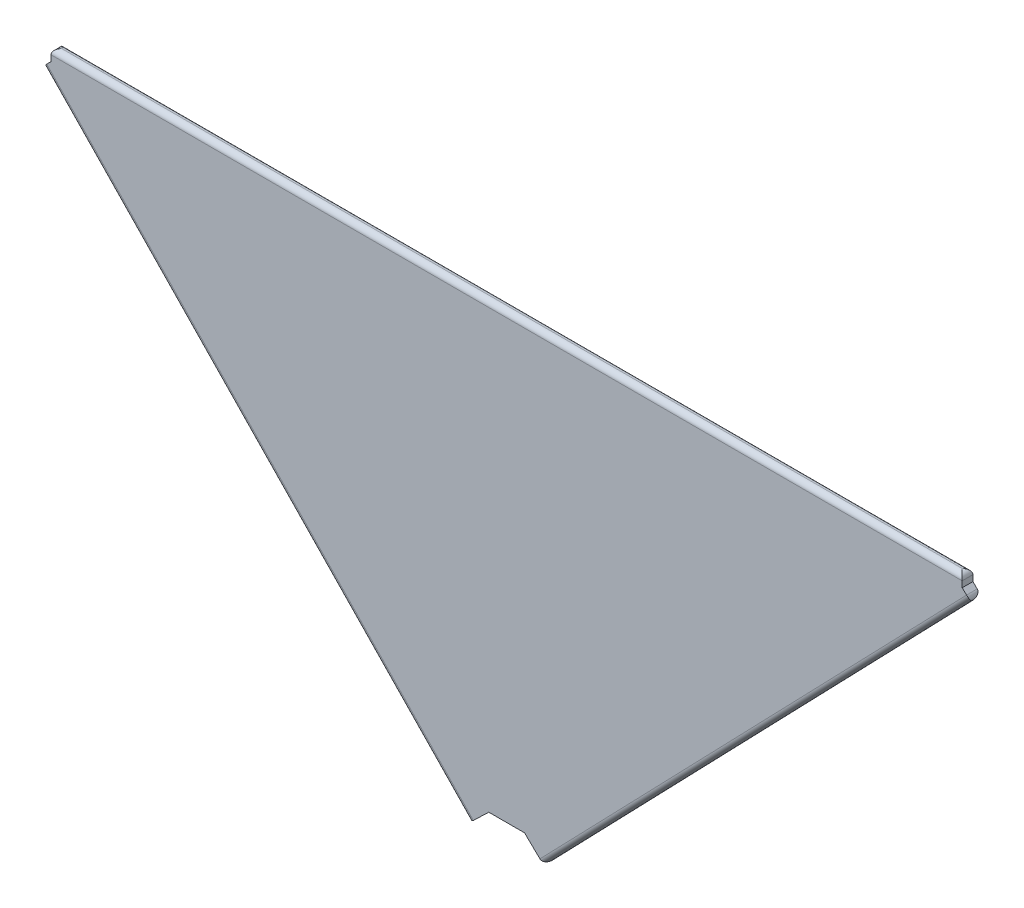
ISO-10303-21;
HEADER;
FILE_DESCRIPTION(('STEP AP214'),'2;1');
FILE_NAME('part.step','',(''),(''),'','','');
FILE_SCHEMA(('AUTOMOTIVE_DESIGN { 1 0 10303 214 1 1 1 1 }'));
ENDSEC;
DATA;
#1=APPLICATION_CONTEXT('core data for automotive mechanical design processes');
#2=APPLICATION_PROTOCOL_DEFINITION('international standard','automotive_design',2000,#1);
#3=PRODUCT_CONTEXT('',#1,'mechanical');
#4=PRODUCT('Part','Part','',(#3));
#5=PRODUCT_RELATED_PRODUCT_CATEGORY('part','',(#4));
#6=PRODUCT_DEFINITION_FORMATION('','',#4);
#7=PRODUCT_DEFINITION_CONTEXT('part definition',#1,'design');
#8=PRODUCT_DEFINITION('design','',#6,#7);
#9=PRODUCT_DEFINITION_SHAPE('','',#8);
#10=(LENGTH_UNIT() NAMED_UNIT(*) SI_UNIT(.MILLI.,.METRE.));
#11=(NAMED_UNIT(*) PLANE_ANGLE_UNIT() SI_UNIT($,.RADIAN.));
#12=(NAMED_UNIT(*) SI_UNIT($,.STERADIAN.) SOLID_ANGLE_UNIT());
#13=UNCERTAINTY_MEASURE_WITH_UNIT(LENGTH_MEASURE(1.E-05),#10,'distance_accuracy_value','');
#14=(GEOMETRIC_REPRESENTATION_CONTEXT(3) GLOBAL_UNCERTAINTY_ASSIGNED_CONTEXT((#13)) GLOBAL_UNIT_ASSIGNED_CONTEXT((#10,
#11,#12)) REPRESENTATION_CONTEXT('',''));
#15=CARTESIAN_POINT('',(0.,0.,0.));
#16=DIRECTION('',(0.,0.,1.));
#17=DIRECTION('',(1.,0.,0.));
#18=AXIS2_PLACEMENT_3D('',#15,#16,#17);
#19=CARTESIAN_POINT('',(8.335900445508,-8.63207760406378,0.2));
#20=DIRECTION('',(-0.694658370459,0.719339800338648,0.));
#21=DIRECTION('',(-0.719339800338648,-0.694658370459,0.));
#22=AXIS2_PLACEMENT_3D('',#19,#20,#21);
#23=PLANE('',#22);
#24=DIRECTION('',(0.719339800338648,0.694658370459,0.));
#25=VECTOR('',#24,1.);
#26=CARTESIAN_POINT('',(8.335900445508,-8.63207760406378,0.2));
#27=LINE('',#26,#25);
#28=CARTESIAN_POINT('',(8.40783442554188,-8.56261176701786,0.2));
#29=VERTEX_POINT('',#28);
#30=CARTESIAN_POINT('',(8.69557034567735,-8.28474841883426,0.2));
#31=VERTEX_POINT('',#30);
#32=EDGE_CURVE('E177',#29,#31,#27,.T.);
#33=ORIENTED_EDGE('',*,*,#32,.F.);
#34=DIRECTION('',(0.,0.,-1.));
#35=VECTOR('',#34,1.);
#36=CARTESIAN_POINT('',(8.40783442554188,-8.56261176701786,0.));
#37=LINE('',#36,#35);
#38=CARTESIAN_POINT('',(8.40783442554188,-8.56261176701786,0.));
#39=VERTEX_POINT('',#38);
#40=EDGE_CURVE('E133',#29,#39,#37,.T.);
#41=ORIENTED_EDGE('',*,*,#40,.T.);
#42=DIRECTION('',(0.719339800338648,0.694658370459,0.));
#43=VECTOR('',#42,1.);
#44=CARTESIAN_POINT('',(8.335900445508,-8.63207760406378,0.));
#45=LINE('',#44,#43);
#46=CARTESIAN_POINT('',(8.69557034567735,-8.28474841883426,0.));
#47=VERTEX_POINT('',#46);
#48=EDGE_CURVE('E120',#39,#47,#45,.T.);
#49=ORIENTED_EDGE('',*,*,#48,.T.);
#50=DIRECTION('',(0.,0.,-1.));
#51=VECTOR('',#50,1.);
#52=CARTESIAN_POINT('',(8.69557034567735,-8.28474841883426,0.2));
#53=LINE('',#52,#51);
#54=EDGE_CURVE('E161',#31,#47,#53,.T.);
#55=ORIENTED_EDGE('',*,*,#54,.F.);
#56=EDGE_LOOP('',(#33,#41,#49,#55));
#57=FACE_BOUND('',#56,.T.);
#58=ADVANCED_FACE('F38',(#57),#23,.F.);
#59=CARTESIAN_POINT('',(-1.28706646789534E-13,-8.28474841883413,0.2));
#60=DIRECTION('',(0.,1.,0.));
#61=DIRECTION('',(-1.,0.,0.));
#62=AXIS2_PLACEMENT_3D('',#59,#60,#61);
#63=PLANE('',#62);
#64=DIRECTION('',(1.,0.,0.));
#65=VECTOR('',#64,1.);
#66=CARTESIAN_POINT('',(-1.28706646789534E-13,-8.28474841883413,0.));
#67=LINE('',#66,#65);
#68=CARTESIAN_POINT('',(9.3655472862567,-8.28474841883427,0.));
#69=VERTEX_POINT('',#68);
#70=EDGE_CURVE('E188',#47,#69,#67,.T.);
#71=ORIENTED_EDGE('',*,*,#70,.T.);
#72=DIRECTION('',(0.,0.,-1.));
#73=VECTOR('',#72,1.);
#74=CARTESIAN_POINT('',(9.3655472862567,-8.28474841883427,0.2));
#75=LINE('',#74,#73);
#76=CARTESIAN_POINT('',(9.3655472862567,-8.28474841883427,0.2));
#77=VERTEX_POINT('',#76);
#78=EDGE_CURVE('E164',#77,#69,#75,.T.);
#79=ORIENTED_EDGE('',*,*,#78,.F.);
#80=DIRECTION('',(1.,0.,0.));
#81=VECTOR('',#80,1.);
#82=CARTESIAN_POINT('',(-1.28706646789534E-13,-8.28474841883413,0.2));
#83=LINE('',#82,#81);
#84=EDGE_CURVE('E207',#31,#77,#83,.T.);
#85=ORIENTED_EDGE('',*,*,#84,.F.);
#86=ORIENTED_EDGE('',*,*,#54,.T.);
#87=EDGE_LOOP('',(#71,#79,#85,#86));
#88=FACE_BOUND('',#87,.T.);
#89=ADVANCED_FACE('F228',(#88),#63,.F.);
#90=CARTESIAN_POINT('',(0.379496412839528,0.392980039470107,0.2));
#91=DIRECTION('',(0.694658370459002,0.719339800338647,0.));
#92=DIRECTION('',(-0.719339800338647,0.694658370459002,0.));
#93=AXIS2_PLACEMENT_3D('',#90,#91,#92);
#94=PLANE('',#93);
#95=DIRECTION('',(0.719339800338647,-0.694658370459002,0.));
#96=VECTOR('',#95,1.);
#97=CARTESIAN_POINT('',(0.379496412839528,0.392980039470107,0.));
#98=LINE('',#97,#96);
#99=CARTESIAN_POINT('',(9.65328320639215,-8.56261176701787,0.));
#100=VERTEX_POINT('',#99);
#101=EDGE_CURVE('E186',#69,#100,#98,.T.);
#102=ORIENTED_EDGE('',*,*,#101,.T.);
#103=DIRECTION('',(0.,0.,-1.));
#104=VECTOR('',#103,1.);
#105=CARTESIAN_POINT('',(9.65328320639215,-8.56261176701787,0.2));
#106=LINE('',#105,#104);
#107=CARTESIAN_POINT('',(9.65328320639215,-8.56261176701787,0.2));
#108=VERTEX_POINT('',#107);
#109=EDGE_CURVE('E48',#100,#108,#106,.F.);
#110=ORIENTED_EDGE('',*,*,#109,.T.);
#111=DIRECTION('',(0.719339800338647,-0.694658370459002,0.));
#112=VECTOR('',#111,1.);
#113=CARTESIAN_POINT('',(0.379496412839528,0.392980039470107,0.2));
#114=LINE('',#113,#112);
#115=EDGE_CURVE('E204',#77,#108,#114,.T.);
#116=ORIENTED_EDGE('',*,*,#115,.F.);
#117=ORIENTED_EDGE('',*,*,#78,.T.);
#118=EDGE_LOOP('',(#102,#110,#116,#117));
#119=FACE_BOUND('',#118,.T.);
#120=ADVANCED_FACE('F240',(#119),#94,.F.);
#121=CARTESIAN_POINT('',(8.36806767311793,8.66538774336454,0.2));
#122=DIRECTION('',(0.694658370458997,0.719339800338651,0.));
#123=DIRECTION('',(-0.719339800338651,0.694658370458997,0.));
#124=AXIS2_PLACEMENT_3D('',#121,#122,#123);
#125=PLANE('',#124);
#126=DIRECTION('',(0.719339800338651,-0.694658370458997,0.));
#127=VECTOR('',#126,1.);
#128=CARTESIAN_POINT('',(8.36806767311793,8.66538774336454,0.2));
#129=LINE('',#128,#127);
#130=CARTESIAN_POINT('',(17.561117631934,-0.212237408104804,0.2));
#131=VERTEX_POINT('',#130);
#132=CARTESIAN_POINT('',(17.6418544666707,-0.290204063123417,0.2));
#133=VERTEX_POINT('',#132);
#134=EDGE_CURVE('E201',#131,#133,#129,.T.);
#135=ORIENTED_EDGE('',*,*,#134,.T.);
#136=DIRECTION('',(0.,0.,-1.));
#137=VECTOR('',#136,1.);
#138=CARTESIAN_POINT('',(17.6418544666707,-0.290204063123418,0.2));
#139=LINE('',#138,#137);
#140=CARTESIAN_POINT('',(17.6418544666707,-0.290204063123422,0.));
#141=VERTEX_POINT('',#140);
#142=EDGE_CURVE('E11',#133,#141,#139,.T.);
#143=ORIENTED_EDGE('',*,*,#142,.T.);
#144=DIRECTION('',(0.719339800338651,-0.694658370458997,0.));
#145=VECTOR('',#144,1.);
#146=CARTESIAN_POINT('',(8.36806767311793,8.66538774336454,0.));
#147=LINE('',#146,#145);
#148=CARTESIAN_POINT('',(17.561117631934,-0.212237408104804,0.));
#149=VERTEX_POINT('',#148);
#150=EDGE_CURVE('E184',#149,#141,#147,.T.);
#151=ORIENTED_EDGE('',*,*,#150,.F.);
#152=DIRECTION('',(0.,0.,-1.));
#153=VECTOR('',#152,1.);
#154=CARTESIAN_POINT('',(17.561117631934,-0.212237408104804,0.2));
#155=LINE('',#154,#153);
#156=EDGE_CURVE('E167',#131,#149,#155,.T.);
#157=ORIENTED_EDGE('',*,*,#156,.F.);
#158=EDGE_LOOP('',(#135,#143,#151,#157));
#159=FACE_BOUND('',#158,.T.);
#160=ADVANCED_FACE('F420',(#159),#125,.T.);
#161=CARTESIAN_POINT('',(17.561117631934,0.,0.2));
#162=DIRECTION('',(1.,0.,0.));
#163=DIRECTION('',(0.,0.,-1.));
#164=AXIS2_PLACEMENT_3D('',#161,#162,#163);
#165=PLANE('',#164);
#166=DIRECTION('',(0.,-1.,0.));
#167=VECTOR('',#166,1.);
#168=CARTESIAN_POINT('',(17.561117631934,0.,0.));
#169=LINE('',#168,#167);
#170=CARTESIAN_POINT('',(17.561117631934,-0.1,0.));
#171=VERTEX_POINT('',#170);
#172=EDGE_CURVE('E181',#171,#149,#169,.T.);
#173=ORIENTED_EDGE('',*,*,#172,.F.);
#174=DIRECTION('',(0.,0.,-1.));
#175=VECTOR('',#174,1.);
#176=CARTESIAN_POINT('',(17.561117631934,-0.1,0.2));
#177=LINE('',#176,#175);
#178=CARTESIAN_POINT('',(17.561117631934,-0.1,0.2));
#179=VERTEX_POINT('',#178);
#180=EDGE_CURVE('E158',#171,#179,#177,.F.);
#181=ORIENTED_EDGE('',*,*,#180,.T.);
#182=DIRECTION('',(0.,-1.,0.));
#183=VECTOR('',#182,1.);
#184=CARTESIAN_POINT('',(17.561117631934,0.,0.2));
#185=LINE('',#184,#183);
#186=EDGE_CURVE('E198',#179,#131,#185,.T.);
#187=ORIENTED_EDGE('',*,*,#186,.T.);
#188=ORIENTED_EDGE('',*,*,#156,.T.);
#189=EDGE_LOOP('',(#173,#181,#187,#188));
#190=FACE_BOUND('',#189,.T.);
#191=ADVANCED_FACE('F411',(#190),#165,.T.);
#192=CARTESIAN_POINT('',(0.5,0.,0.2));
#193=DIRECTION('',(-1.,0.,0.));
#194=DIRECTION('',(0.,0.,1.));
#195=AXIS2_PLACEMENT_3D('',#192,#193,#194);
#196=PLANE('',#195);
#197=DIRECTION('',(0.,1.,0.));
#198=VECTOR('',#197,1.);
#199=CARTESIAN_POINT('',(0.5,0.,0.2));
#200=LINE('',#199,#198);
#201=CARTESIAN_POINT('',(0.5,-0.212237408104801,0.2));
#202=VERTEX_POINT('',#201);
#203=CARTESIAN_POINT('',(0.5,-0.1,0.2));
#204=VERTEX_POINT('',#203);
#205=EDGE_CURVE('E195',#202,#204,#200,.T.);
#206=ORIENTED_EDGE('',*,*,#205,.T.);
#207=DIRECTION('',(0.,0.,-1.));
#208=VECTOR('',#207,1.);
#209=CARTESIAN_POINT('',(0.5,-0.1,0.2));
#210=LINE('',#209,#208);
#211=CARTESIAN_POINT('',(0.5,-0.1,0.));
#212=VERTEX_POINT('',#211);
#213=EDGE_CURVE('E146',#204,#212,#210,.T.);
#214=ORIENTED_EDGE('',*,*,#213,.T.);
#215=DIRECTION('',(0.,1.,0.));
#216=VECTOR('',#215,1.);
#217=CARTESIAN_POINT('',(0.5,0.,0.));
#218=LINE('',#217,#216);
#219=CARTESIAN_POINT('',(0.5,-0.212237408104801,0.));
#220=VERTEX_POINT('',#219);
#221=EDGE_CURVE('E178',#220,#212,#218,.T.);
#222=ORIENTED_EDGE('',*,*,#221,.F.);
#223=DIRECTION('',(0.,0.,-1.));
#224=VECTOR('',#223,1.);
#225=CARTESIAN_POINT('',(0.5,-0.212237408104801,0.2));
#226=LINE('',#225,#224);
#227=EDGE_CURVE('E170',#202,#220,#226,.T.);
#228=ORIENTED_EDGE('',*,*,#227,.F.);
#229=EDGE_LOOP('',(#206,#214,#222,#228));
#230=FACE_BOUND('',#229,.T.);
#231=ADVANCED_FACE('F403',(#230),#196,.T.);
#232=CARTESIAN_POINT('',(0.347329185229501,-0.359669900169324,0.2));
#233=DIRECTION('',(-0.694658370459001,0.719339800338647,0.));
#234=DIRECTION('',(-0.719339800338647,-0.694658370459001,0.));
#235=AXIS2_PLACEMENT_3D('',#232,#233,#234);
#236=PLANE('',#235);
#237=DIRECTION('',(0.719339800338647,0.694658370459001,0.));
#238=VECTOR('',#237,1.);
#239=CARTESIAN_POINT('',(0.347329185229501,-0.359669900169324,0.));
#240=LINE('',#239,#238);
#241=CARTESIAN_POINT('',(0.419263165263365,-0.290204063123424,0.));
#242=VERTEX_POINT('',#241);
#243=EDGE_CURVE('E174',#242,#220,#240,.T.);
#244=ORIENTED_EDGE('',*,*,#243,.F.);
#245=DIRECTION('',(0.,0.,-1.));
#246=VECTOR('',#245,1.);
#247=CARTESIAN_POINT('',(0.419263165263365,-0.290204063123424,0.2));
#248=LINE('',#247,#246);
#249=CARTESIAN_POINT('',(0.419263165263365,-0.290204063123424,0.2));
#250=VERTEX_POINT('',#249);
#251=EDGE_CURVE('E136',#242,#250,#248,.F.);
#252=ORIENTED_EDGE('',*,*,#251,.T.);
#253=DIRECTION('',(0.719339800338647,0.694658370459001,0.));
#254=VECTOR('',#253,1.);
#255=CARTESIAN_POINT('',(0.347329185229501,-0.359669900169324,0.2));
#256=LINE('',#255,#254);
#257=EDGE_CURVE('E173',#250,#202,#256,.T.);
#258=ORIENTED_EDGE('',*,*,#257,.T.);
#259=ORIENTED_EDGE('',*,*,#227,.T.);
#260=EDGE_LOOP('',(#244,#252,#258,#259));
#261=FACE_BOUND('',#260,.T.);
#262=ADVANCED_FACE('F265',(#261),#236,.T.);
#263=CARTESIAN_POINT('',(0.,0.,0.2));
#264=DIRECTION('',(0.,0.,1.));
#265=DIRECTION('',(1.,0.,0.));
#266=AXIS2_PLACEMENT_3D('',#263,#264,#265);
#267=PLANE('',#266);
#268=ORIENTED_EDGE('',*,*,#186,.F.);
#269=DIRECTION('',(1.,0.,0.));
#270=VECTOR('',#269,1.);
#271=CARTESIAN_POINT('',(0.,-0.1,0.2));
#272=LINE('',#271,#270);
#273=EDGE_CURVE('E149',#179,#204,#272,.F.);
#274=ORIENTED_EDGE('',*,*,#273,.T.);
#275=ORIENTED_EDGE('',*,*,#205,.F.);
#276=ORIENTED_EDGE('',*,*,#257,.F.);
#277=DIRECTION('',(-0.694658370459001,0.719339800338647,0.));
#278=VECTOR('',#277,1.);
#279=CARTESIAN_POINT('',(0.0719339800338637,0.0694658370458991,0.2));
#280=LINE('',#279,#278);
#281=EDGE_CURVE('E152',#250,#29,#280,.F.);
#282=ORIENTED_EDGE('',*,*,#281,.T.);
#283=ORIENTED_EDGE('',*,*,#32,.T.);
#284=ORIENTED_EDGE('',*,*,#84,.T.);
#285=ORIENTED_EDGE('',*,*,#115,.T.);
#286=DIRECTION('',(-0.694658370459001,-0.719339800338648,0.));
#287=VECTOR('',#286,1.);
#288=CARTESIAN_POINT('',(9.27378679355264,-8.95559180648797,0.2));
#289=LINE('',#288,#287);
#290=EDGE_CURVE('E155',#108,#133,#289,.F.);
#291=ORIENTED_EDGE('',*,*,#290,.T.);
#292=ORIENTED_EDGE('',*,*,#134,.F.);
#293=EDGE_LOOP('',(#268,#274,#275,#276,#282,#283,#284,#285,#291,#292));
#294=FACE_BOUND('',#293,.T.);
#295=ADVANCED_FACE('F216',(#294),#267,.T.);
#296=CARTESIAN_POINT('',(0.,0.,0.));
#297=DIRECTION('',(0.,0.,1.));
#298=DIRECTION('',(1.,0.,0.));
#299=AXIS2_PLACEMENT_3D('',#296,#297,#298);
#300=PLANE('',#299);
#301=ORIENTED_EDGE('',*,*,#221,.T.);
#302=DIRECTION('',(1.,0.,0.));
#303=VECTOR('',#302,1.);
#304=CARTESIAN_POINT('',(17.561117631934,-0.1,0.));
#305=LINE('',#304,#303);
#306=EDGE_CURVE('E139',#212,#171,#305,.T.);
#307=ORIENTED_EDGE('',*,*,#306,.T.);
#308=ORIENTED_EDGE('',*,*,#172,.T.);
#309=ORIENTED_EDGE('',*,*,#150,.T.);
#310=DIRECTION('',(-0.694658370459001,-0.719339800338648,0.));
#311=VECTOR('',#310,1.);
#312=CARTESIAN_POINT('',(9.65328320639215,-8.56261176701787,0.));
#313=LINE('',#312,#311);
#314=EDGE_CURVE('E57',#141,#100,#313,.T.);
#315=ORIENTED_EDGE('',*,*,#314,.T.);
#316=ORIENTED_EDGE('',*,*,#101,.F.);
#317=ORIENTED_EDGE('',*,*,#70,.F.);
#318=ORIENTED_EDGE('',*,*,#48,.F.);
#319=DIRECTION('',(-0.694658370459001,0.719339800338647,0.));
#320=VECTOR('',#319,1.);
#321=CARTESIAN_POINT('',(0.419263165263365,-0.290204063123424,0.));
#322=LINE('',#321,#320);
#323=EDGE_CURVE('E142',#39,#242,#322,.T.);
#324=ORIENTED_EDGE('',*,*,#323,.T.);
#325=ORIENTED_EDGE('',*,*,#243,.T.);
#326=EDGE_LOOP('',(#301,#307,#308,#309,#315,#316,#317,#318,#324,#325));
#327=FACE_BOUND('',#326,.T.);
#328=ADVANCED_FACE('F236',(#327),#300,.F.);
#329=CARTESIAN_POINT('',(0.6,-0.1,0.2));
#330=DIRECTION('',(0.,0.,-1.));
#331=DIRECTION('',(-1.,0.,0.));
#332=AXIS2_PLACEMENT_3D('',#329,#330,#331);
#333=CYLINDRICAL_SURFACE('',#332,0.1);
#334=CARTESIAN_POINT('',(0.6,-0.1,0.1));
#335=DIRECTION('',(-0.707106781186547,0.,0.707106781186547));
#336=DIRECTION('',(-0.707106781186547,0.,-0.707106781186547));
#337=AXIS2_PLACEMENT_3D('',#334,#335,#336);
#338=ELLIPSE('',#337,0.14142135623731,0.1);
#339=CARTESIAN_POINT('',(0.6,0.,0.1));
#340=VERTEX_POINT('',#339);
#341=EDGE_CURVE('E123',#212,#340,#338,.F.);
#342=ORIENTED_EDGE('',*,*,#341,.F.);
#343=ORIENTED_EDGE('',*,*,#213,.F.);
#344=CARTESIAN_POINT('',(0.6,-0.1,0.1));
#345=DIRECTION('',(-0.707106781186547,0.,-0.707106781186547));
#346=DIRECTION('',(0.707106781186547,0.,-0.707106781186547));
#347=AXIS2_PLACEMENT_3D('',#344,#345,#346);
#348=ELLIPSE('',#347,0.14142135623731,0.1);
#349=EDGE_CURVE('E117',#340,#204,#348,.F.);
#350=ORIENTED_EDGE('',*,*,#349,.F.);
#351=EDGE_LOOP('',(#342,#343,#350));
#352=FACE_BOUND('',#351,.T.);
#353=ADVANCED_FACE('F303',(#352),#333,.T.);
#354=CARTESIAN_POINT('',(0.,-0.1,0.1));
#355=DIRECTION('',(1.,0.,0.));
#356=DIRECTION('',(0.,0.,-1.));
#357=AXIS2_PLACEMENT_3D('',#354,#355,#356);
#358=CYLINDRICAL_SURFACE('',#357,0.1);
#359=DIRECTION('',(1.,0.,0.));
#360=VECTOR('',#359,1.);
#361=CARTESIAN_POINT('',(0.,0.,0.1));
#362=LINE('',#361,#360);
#363=CARTESIAN_POINT('',(17.461117631934,0.,0.1));
#364=VERTEX_POINT('',#363);
#365=EDGE_CURVE('E121',#340,#364,#362,.T.);
#366=ORIENTED_EDGE('',*,*,#365,.F.);
#367=ORIENTED_EDGE('',*,*,#349,.T.);
#368=ORIENTED_EDGE('',*,*,#273,.F.);
#369=CARTESIAN_POINT('',(17.461117631934,-0.1,0.1));
#370=DIRECTION('',(0.707106781186547,0.,-0.707106781186547));
#371=DIRECTION('',(0.707106781186547,0.,0.707106781186547));
#372=AXIS2_PLACEMENT_3D('',#369,#370,#371);
#373=ELLIPSE('',#372,0.14142135623731,0.1);
#374=EDGE_CURVE('E126',#364,#179,#373,.T.);
#375=ORIENTED_EDGE('',*,*,#374,.F.);
#376=EDGE_LOOP('',(#366,#367,#368,#375));
#377=FACE_BOUND('',#376,.T.);
#378=ADVANCED_FACE('F299',(#377),#358,.T.);
#379=CARTESIAN_POINT('',(0.,-0.1,0.1));
#380=DIRECTION('',(-1.,0.,0.));
#381=DIRECTION('',(0.,0.,1.));
#382=AXIS2_PLACEMENT_3D('',#379,#380,#381);
#383=CYLINDRICAL_SURFACE('',#382,0.1);
#384=ORIENTED_EDGE('',*,*,#341,.T.);
#385=ORIENTED_EDGE('',*,*,#365,.T.);
#386=CARTESIAN_POINT('',(17.461117631934,-0.1,0.1));
#387=DIRECTION('',(-0.707106781186547,0.,-0.707106781186547));
#388=DIRECTION('',(-0.707106781186547,0.,0.707106781186547));
#389=AXIS2_PLACEMENT_3D('',#386,#387,#388);
#390=ELLIPSE('',#389,0.14142135623731,0.1);
#391=EDGE_CURVE('E106',#171,#364,#390,.F.);
#392=ORIENTED_EDGE('',*,*,#391,.F.);
#393=ORIENTED_EDGE('',*,*,#306,.F.);
#394=EDGE_LOOP('',(#384,#385,#392,#393));
#395=FACE_BOUND('',#394,.T.);
#396=ADVANCED_FACE('F285',(#395),#383,.T.);
#397=CARTESIAN_POINT('',(17.461117631934,-0.1,0.2));
#398=DIRECTION('',(0.,0.,-1.));
#399=DIRECTION('',(-1.,0.,0.));
#400=AXIS2_PLACEMENT_3D('',#397,#398,#399);
#401=CYLINDRICAL_SURFACE('',#400,0.1);
#402=ORIENTED_EDGE('',*,*,#374,.T.);
#403=ORIENTED_EDGE('',*,*,#180,.F.);
#404=ORIENTED_EDGE('',*,*,#391,.T.);
#405=EDGE_LOOP('',(#402,#403,#404));
#406=FACE_BOUND('',#405,.T.);
#407=ADVANCED_FACE('F278',(#406),#401,.T.);
#408=CARTESIAN_POINT('',(8.33836858849598,-8.490677786984,0.2));
#409=DIRECTION('',(0.,0.,1.));
#410=DIRECTION('',(1.,0.,0.));
#411=AXIS2_PLACEMENT_3D('',#408,#409,#410);
#412=CYLINDRICAL_SURFACE('',#411,0.1);
#413=CARTESIAN_POINT('',(8.33836858849598,-8.490677786984,0.1));
#414=DIRECTION('',(0.491197644359557,-0.508650050796835,0.707106781186547));
#415=DIRECTION('',(0.491197644359557,-0.508650050796835,-0.707106781186547));
#416=AXIS2_PLACEMENT_3D('',#413,#414,#415);
#417=ELLIPSE('',#416,0.14142135623731,0.1);
#418=CARTESIAN_POINT('',(8.26643460846211,-8.5601436240299,0.1));
#419=VERTEX_POINT('',#418);
#420=EDGE_CURVE('E109',#39,#419,#417,.F.);
#421=ORIENTED_EDGE('',*,*,#420,.F.);
#422=ORIENTED_EDGE('',*,*,#40,.F.);
#423=CARTESIAN_POINT('',(8.33836858849598,-8.490677786984,0.1));
#424=DIRECTION('',(-0.491197644359557,0.508650050796835,0.707106781186547));
#425=DIRECTION('',(0.491197644359557,-0.508650050796835,0.707106781186547));
#426=AXIS2_PLACEMENT_3D('',#423,#424,#425);
#427=ELLIPSE('',#426,0.14142135623731,0.1);
#428=EDGE_CURVE('E103',#419,#29,#427,.T.);
#429=ORIENTED_EDGE('',*,*,#428,.F.);
#430=EDGE_LOOP('',(#421,#422,#429));
#431=FACE_BOUND('',#430,.T.);
#432=ADVANCED_FACE('F276',(#431),#412,.T.);
#433=CARTESIAN_POINT('',(0.0719339800338641,0.0694658370458995,0.1));
#434=DIRECTION('',(-0.694658370459001,0.719339800338647,0.));
#435=DIRECTION('',(-0.719339800338647,-0.694658370459001,0.));
#436=AXIS2_PLACEMENT_3D('',#433,#434,#435);
#437=CYLINDRICAL_SURFACE('',#436,0.1);
#438=DIRECTION('',(-0.694658370459001,0.719339800338647,0.));
#439=VECTOR('',#438,1.);
#440=CARTESIAN_POINT('',(0.,0.,0.1));
#441=LINE('',#440,#439);
#442=CARTESIAN_POINT('',(0.4167950222754,-0.431603880203189,0.1));
#443=VERTEX_POINT('',#442);
#444=EDGE_CURVE('E107',#419,#443,#441,.T.);
#445=ORIENTED_EDGE('',*,*,#444,.F.);
#446=ORIENTED_EDGE('',*,*,#428,.T.);
#447=ORIENTED_EDGE('',*,*,#281,.F.);
#448=CARTESIAN_POINT('',(0.488729002309265,-0.362138043157289,0.1));
#449=DIRECTION('',(-0.491197644359557,0.508650050796835,-0.707106781186547));
#450=DIRECTION('',(-0.491197644359557,0.508650050796835,0.707106781186547));
#451=AXIS2_PLACEMENT_3D('',#448,#449,#450);
#452=ELLIPSE('',#451,0.14142135623731,0.1);
#453=EDGE_CURVE('E112',#443,#250,#452,.T.);
#454=ORIENTED_EDGE('',*,*,#453,.F.);
#455=EDGE_LOOP('',(#445,#446,#447,#454));
#456=FACE_BOUND('',#455,.T.);
#457=ADVANCED_FACE('F274',(#456),#437,.T.);
#458=CARTESIAN_POINT('',(0.0719339800338641,0.0694658370458995,0.1));
#459=DIRECTION('',(0.694658370459001,-0.719339800338647,0.));
#460=DIRECTION('',(0.719339800338647,0.694658370459001,0.));
#461=AXIS2_PLACEMENT_3D('',#458,#459,#460);
#462=CYLINDRICAL_SURFACE('',#461,0.1);
#463=ORIENTED_EDGE('',*,*,#420,.T.);
#464=ORIENTED_EDGE('',*,*,#444,.T.);
#465=CARTESIAN_POINT('',(0.488729002309265,-0.362138043157289,0.1));
#466=DIRECTION('',(0.491197644359557,-0.508650050796835,-0.707106781186547));
#467=DIRECTION('',(0.491197644359557,-0.508650050796835,0.707106781186547));
#468=AXIS2_PLACEMENT_3D('',#465,#466,#467);
#469=ELLIPSE('',#468,0.14142135623731,0.1);
#470=EDGE_CURVE('E92',#242,#443,#469,.F.);
#471=ORIENTED_EDGE('',*,*,#470,.F.);
#472=ORIENTED_EDGE('',*,*,#323,.F.);
#473=EDGE_LOOP('',(#463,#464,#471,#472));
#474=FACE_BOUND('',#473,.T.);
#475=ADVANCED_FACE('F271',(#474),#462,.T.);
#476=CARTESIAN_POINT('',(0.488729002309265,-0.362138043157289,0.2));
#477=DIRECTION('',(0.,0.,-1.));
#478=DIRECTION('',(-1.,0.,0.));
#479=AXIS2_PLACEMENT_3D('',#476,#477,#478);
#480=CYLINDRICAL_SURFACE('',#479,0.1);
#481=ORIENTED_EDGE('',*,*,#453,.T.);
#482=ORIENTED_EDGE('',*,*,#251,.F.);
#483=ORIENTED_EDGE('',*,*,#470,.T.);
#484=EDGE_LOOP('',(#481,#482,#483));
#485=FACE_BOUND('',#484,.T.);
#486=ADVANCED_FACE('F269',(#485),#480,.T.);
#487=CARTESIAN_POINT('',(17.5723886296248,-0.362138043157283,0.2));
#488=DIRECTION('',(0.,0.,-1.));
#489=DIRECTION('',(-1.,0.,0.));
#490=AXIS2_PLACEMENT_3D('',#487,#488,#489);
#491=CYLINDRICAL_SURFACE('',#490,0.1);
#492=CARTESIAN_POINT('',(17.5723886296248,-0.362138043157285,0.1));
#493=DIRECTION('',(0.491197644359557,0.508650050796835,0.707106781186547));
#494=DIRECTION('',(0.491197644359557,0.508650050796835,-0.707106781186547));
#495=AXIS2_PLACEMENT_3D('',#492,#493,#494);
#496=ELLIPSE('',#495,0.14142135623731,0.1);
#497=CARTESIAN_POINT('',(17.6443226096586,-0.431603880203186,0.1));
#498=VERTEX_POINT('',#497);
#499=EDGE_CURVE('E88',#141,#498,#496,.F.);
#500=ORIENTED_EDGE('',*,*,#499,.F.);
#501=ORIENTED_EDGE('',*,*,#142,.F.);
#502=CARTESIAN_POINT('',(17.5723886296248,-0.362138043157284,0.1));
#503=DIRECTION('',(0.491197644359557,0.508650050796835,-0.707106781186547));
#504=DIRECTION('',(-0.491197644359557,-0.508650050796835,-0.707106781186547));
#505=AXIS2_PLACEMENT_3D('',#502,#503,#504);
#506=ELLIPSE('',#505,0.14142135623731,0.1);
#507=EDGE_CURVE('E42',#498,#133,#506,.F.);
#508=ORIENTED_EDGE('',*,*,#507,.F.);
#509=EDGE_LOOP('',(#500,#501,#508));
#510=FACE_BOUND('',#509,.T.);
#511=ADVANCED_FACE('F40',(#510),#491,.T.);
#512=CARTESIAN_POINT('',(9.27378679355264,-8.95559180648796,0.1));
#513=DIRECTION('',(-0.694658370459001,-0.719339800338648,0.));
#514=DIRECTION('',(0.719339800338648,-0.694658370459001,0.));
#515=AXIS2_PLACEMENT_3D('',#512,#513,#514);
#516=CYLINDRICAL_SURFACE('',#515,0.1);
#517=DIRECTION('',(-0.694658370459001,-0.719339800338648,0.));
#518=VECTOR('',#517,1.);
#519=CARTESIAN_POINT('',(9.3457207735865,-9.02505764353386,0.1));
#520=LINE('',#519,#518);
#521=CARTESIAN_POINT('',(9.79468302347192,-8.5601436240299,0.1));
#522=VERTEX_POINT('',#521);
#523=EDGE_CURVE('E81',#498,#522,#520,.T.);
#524=ORIENTED_EDGE('',*,*,#523,.F.);
#525=ORIENTED_EDGE('',*,*,#507,.T.);
#526=ORIENTED_EDGE('',*,*,#290,.F.);
#527=CARTESIAN_POINT('',(9.72274904343805,-8.490677786984,0.1));
#528=DIRECTION('',(-0.491197644359557,-0.508650050796835,-0.707106781186547));
#529=DIRECTION('',(-0.491197644359557,-0.508650050796835,0.707106781186547));
#530=AXIS2_PLACEMENT_3D('',#527,#528,#529);
#531=ELLIPSE('',#530,0.14142135623731,0.1);
#532=EDGE_CURVE('E95',#522,#108,#531,.T.);
#533=ORIENTED_EDGE('',*,*,#532,.F.);
#534=EDGE_LOOP('',(#524,#525,#526,#533));
#535=FACE_BOUND('',#534,.T.);
#536=ADVANCED_FACE('F93',(#535),#516,.T.);
#537=CARTESIAN_POINT('',(9.27378679355264,-8.95559180648796,0.1));
#538=DIRECTION('',(0.694658370459001,0.719339800338648,0.));
#539=DIRECTION('',(-0.719339800338648,0.694658370459001,0.));
#540=AXIS2_PLACEMENT_3D('',#537,#538,#539);
#541=CYLINDRICAL_SURFACE('',#540,0.1);
#542=ORIENTED_EDGE('',*,*,#499,.T.);
#543=ORIENTED_EDGE('',*,*,#523,.T.);
#544=CARTESIAN_POINT('',(9.72274904343805,-8.490677786984,0.1));
#545=DIRECTION('',(0.491197644359557,0.508650050796835,-0.707106781186547));
#546=DIRECTION('',(0.491197644359557,0.508650050796835,0.707106781186547));
#547=AXIS2_PLACEMENT_3D('',#544,#545,#546);
#548=ELLIPSE('',#547,0.14142135623731,0.1);
#549=EDGE_CURVE('E99',#100,#522,#548,.F.);
#550=ORIENTED_EDGE('',*,*,#549,.F.);
#551=ORIENTED_EDGE('',*,*,#314,.F.);
#552=EDGE_LOOP('',(#542,#543,#550,#551));
#553=FACE_BOUND('',#552,.T.);
#554=ADVANCED_FACE('F97',(#553),#541,.T.);
#555=CARTESIAN_POINT('',(9.72274904343805,-8.490677786984,0.2));
#556=DIRECTION('',(0.,0.,1.));
#557=DIRECTION('',(1.,0.,0.));
#558=AXIS2_PLACEMENT_3D('',#555,#556,#557);
#559=CYLINDRICAL_SURFACE('',#558,0.1);
#560=ORIENTED_EDGE('',*,*,#532,.T.);
#561=ORIENTED_EDGE('',*,*,#109,.F.);
#562=ORIENTED_EDGE('',*,*,#549,.T.);
#563=EDGE_LOOP('',(#560,#561,#562));
#564=FACE_BOUND('',#563,.T.);
#565=ADVANCED_FACE('F335',(#564),#559,.T.);
#566=CLOSED_SHELL('',(#58,#89,#120,#160,#191,#231,#262,#295,#328,#353,#378,#396,#407,#432,#457,
#475,#486,#511,#536,#554,#565));
#567=MANIFOLD_SOLID_BREP('B2',#566);
#568=ADVANCED_BREP_SHAPE_REPRESENTATION('',(#18,#567),#14);
#569=SHAPE_DEFINITION_REPRESENTATION(#9,#568);
ENDSEC;
END-ISO-10303-21;
